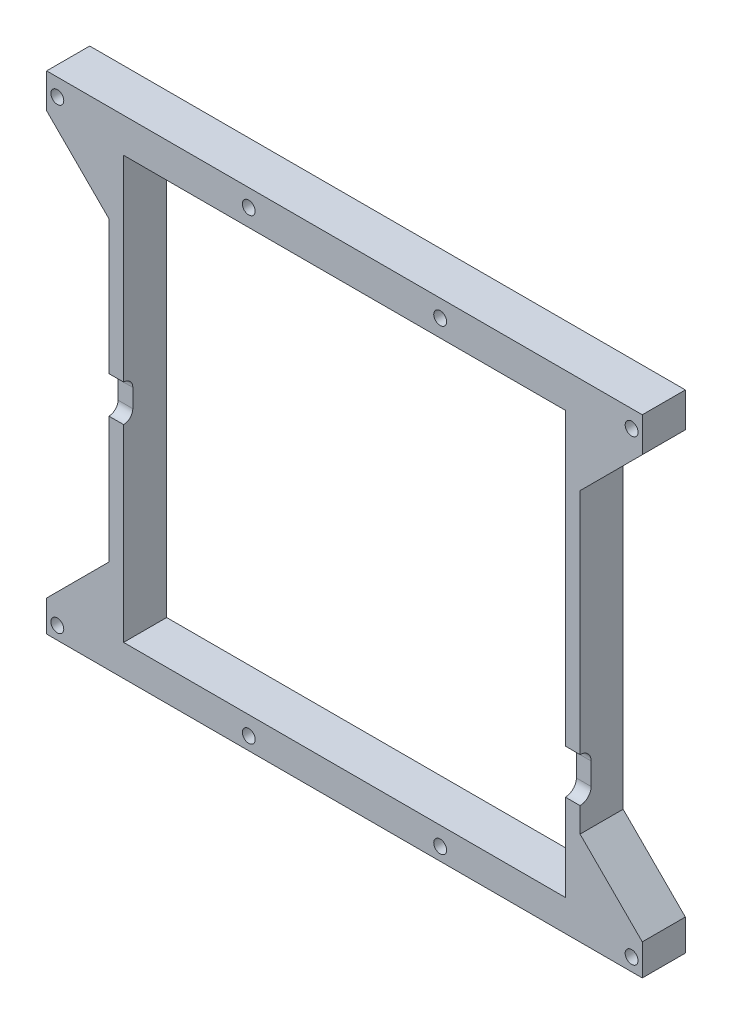
ISO-10303-21;
HEADER;
FILE_DESCRIPTION(('STEP AP214'),'2;1');
FILE_NAME('part.step','',(''),(''),'','','');
FILE_SCHEMA(('AUTOMOTIVE_DESIGN { 1 0 10303 214 1 1 1 1 }'));
ENDSEC;
DATA;
#1=APPLICATION_CONTEXT('core data for automotive mechanical design processes');
#2=APPLICATION_PROTOCOL_DEFINITION('international standard','automotive_design',2000,#1);
#3=PRODUCT_CONTEXT('',#1,'mechanical');
#4=PRODUCT('Part','Part','',(#3));
#5=PRODUCT_RELATED_PRODUCT_CATEGORY('part','',(#4));
#6=PRODUCT_DEFINITION_FORMATION('','',#4);
#7=PRODUCT_DEFINITION_CONTEXT('part definition',#1,'design');
#8=PRODUCT_DEFINITION('design','',#6,#7);
#9=PRODUCT_DEFINITION_SHAPE('','',#8);
#10=(LENGTH_UNIT() NAMED_UNIT(*) SI_UNIT(.MILLI.,.METRE.));
#11=(NAMED_UNIT(*) PLANE_ANGLE_UNIT() SI_UNIT($,.RADIAN.));
#12=(NAMED_UNIT(*) SI_UNIT($,.STERADIAN.) SOLID_ANGLE_UNIT());
#13=UNCERTAINTY_MEASURE_WITH_UNIT(LENGTH_MEASURE(1.E-05),#10,'distance_accuracy_value','');
#14=(GEOMETRIC_REPRESENTATION_CONTEXT(3) GLOBAL_UNCERTAINTY_ASSIGNED_CONTEXT((#13)) GLOBAL_UNIT_ASSIGNED_CONTEXT((#10,
#11,#12)) REPRESENTATION_CONTEXT('',''));
#15=CARTESIAN_POINT('',(0.,0.,0.));
#16=DIRECTION('',(0.,0.,1.));
#17=DIRECTION('',(1.,0.,0.));
#18=AXIS2_PLACEMENT_3D('',#15,#16,#17);
#19=CARTESIAN_POINT('',(0.,0.,5.3));
#20=DIRECTION('',(0.,0.,1.));
#21=DIRECTION('',(1.,0.,0.));
#22=AXIS2_PLACEMENT_3D('',#19,#20,#21);
#23=PLANE('',#22);
#24=CARTESIAN_POINT('',(-78.,63.0634008211343,5.3));
#25=DIRECTION('',(0.,0.,1.));
#26=DIRECTION('',(1.,0.,0.));
#27=AXIS2_PLACEMENT_3D('',#24,#25,#26);
#28=CIRCLE('',#27,1.75);
#29=CARTESIAN_POINT('',(-76.25,63.0634008211343,5.3));
#30=VERTEX_POINT('',#29);
#31=EDGE_CURVE('E402',#30,#30,#28,.F.);
#32=ORIENTED_EDGE('',*,*,#31,.F.);
#33=EDGE_LOOP('',(#32));
#34=FACE_BOUND('',#33,.T.);
#35=CARTESIAN_POINT('',(26.,-61.2365991788657,5.3));
#36=DIRECTION('',(0.,0.,1.));
#37=DIRECTION('',(1.,0.,0.));
#38=AXIS2_PLACEMENT_3D('',#35,#36,#37);
#39=CIRCLE('',#38,1.75000000000001);
#40=CARTESIAN_POINT('',(27.75,-61.2365991788657,5.3));
#41=VERTEX_POINT('',#40);
#42=EDGE_CURVE('E396',#41,#41,#39,.F.);
#43=ORIENTED_EDGE('',*,*,#42,.F.);
#44=EDGE_LOOP('',(#43));
#45=FACE_BOUND('',#44,.T.);
#46=CARTESIAN_POINT('',(-26.,63.0634008211343,5.3));
#47=DIRECTION('',(0.,0.,1.));
#48=DIRECTION('',(1.,0.,0.));
#49=AXIS2_PLACEMENT_3D('',#46,#47,#48);
#50=CIRCLE('',#49,1.75000000000001);
#51=CARTESIAN_POINT('',(-24.25,63.0634008211343,5.3));
#52=VERTEX_POINT('',#51);
#53=EDGE_CURVE('E390',#52,#52,#50,.F.);
#54=ORIENTED_EDGE('',*,*,#53,.F.);
#55=EDGE_LOOP('',(#54));
#56=FACE_BOUND('',#55,.T.);
#57=CARTESIAN_POINT('',(78.,63.0634008211343,5.3));
#58=DIRECTION('',(0.,0.,1.));
#59=DIRECTION('',(1.,0.,0.));
#60=AXIS2_PLACEMENT_3D('',#57,#58,#59);
#61=CIRCLE('',#60,1.75000000000001);
#62=CARTESIAN_POINT('',(79.75,63.0634008211343,5.3));
#63=VERTEX_POINT('',#62);
#64=EDGE_CURVE('E384',#63,#63,#61,.F.);
#65=ORIENTED_EDGE('',*,*,#64,.F.);
#66=EDGE_LOOP('',(#65));
#67=FACE_BOUND('',#66,.T.);
#68=DIRECTION('',(1.,0.,0.));
#69=VECTOR('',#68,1.);
#70=CARTESIAN_POINT('',(0.,-56.2365991788657,5.3));
#71=LINE('',#70,#69);
#72=CARTESIAN_POINT('',(-60.,-56.2365991788657,5.3));
#73=VERTEX_POINT('',#72);
#74=CARTESIAN_POINT('',(60.,-56.2365991788657,5.3));
#75=VERTEX_POINT('',#74);
#76=EDGE_CURVE('E43',#73,#75,#71,.T.);
#77=ORIENTED_EDGE('',*,*,#76,.T.);
#78=DIRECTION('',(0.,1.,0.));
#79=VECTOR('',#78,1.);
#80=CARTESIAN_POINT('',(60.,0.,5.3));
#81=LINE('',#80,#79);
#82=CARTESIAN_POINT('',(60.,58.3634008211343,5.3));
#83=VERTEX_POINT('',#82);
#84=EDGE_CURVE('E11',#75,#83,#81,.T.);
#85=ORIENTED_EDGE('',*,*,#84,.T.);
#86=DIRECTION('',(1.,0.,0.));
#87=VECTOR('',#86,1.);
#88=CARTESIAN_POINT('',(0.,58.3634008211343,5.3));
#89=LINE('',#88,#87);
#90=CARTESIAN_POINT('',(-60.,58.3634008211343,5.3));
#91=VERTEX_POINT('',#90);
#92=EDGE_CURVE('E51',#91,#83,#89,.T.);
#93=ORIENTED_EDGE('',*,*,#92,.F.);
#94=DIRECTION('',(0.,1.,0.));
#95=VECTOR('',#94,1.);
#96=CARTESIAN_POINT('',(-60.,0.,5.3));
#97=LINE('',#96,#95);
#98=EDGE_CURVE('E379',#73,#91,#97,.T.);
#99=ORIENTED_EDGE('',*,*,#98,.F.);
#100=EDGE_LOOP('',(#77,#85,#93,#99));
#101=FACE_BOUND('',#100,.T.);
#102=CARTESIAN_POINT('',(-78.,-61.2365991788657,5.3));
#103=DIRECTION('',(0.,0.,1.));
#104=DIRECTION('',(1.,0.,0.));
#105=AXIS2_PLACEMENT_3D('',#102,#103,#104);
#106=CIRCLE('',#105,1.75);
#107=CARTESIAN_POINT('',(-76.25,-61.2365991788657,5.3));
#108=VERTEX_POINT('',#107);
#109=EDGE_CURVE('E378',#108,#108,#106,.F.);
#110=ORIENTED_EDGE('',*,*,#109,.F.);
#111=EDGE_LOOP('',(#110));
#112=FACE_BOUND('',#111,.T.);
#113=CARTESIAN_POINT('',(26.,63.0634008211343,5.3));
#114=DIRECTION('',(0.,0.,1.));
#115=DIRECTION('',(1.,0.,0.));
#116=AXIS2_PLACEMENT_3D('',#113,#114,#115);
#117=CIRCLE('',#116,1.75000000000001);
#118=CARTESIAN_POINT('',(27.75,63.0634008211343,5.3));
#119=VERTEX_POINT('',#118);
#120=EDGE_CURVE('E387',#119,#119,#117,.F.);
#121=ORIENTED_EDGE('',*,*,#120,.F.);
#122=EDGE_LOOP('',(#121));
#123=FACE_BOUND('',#122,.T.);
#124=CARTESIAN_POINT('',(-26.,-61.2365991788657,5.3));
#125=DIRECTION('',(0.,0.,1.));
#126=DIRECTION('',(1.,0.,0.));
#127=AXIS2_PLACEMENT_3D('',#124,#125,#126);
#128=CIRCLE('',#127,1.75000000000001);
#129=CARTESIAN_POINT('',(-24.25,-61.2365991788657,5.3));
#130=VERTEX_POINT('',#129);
#131=EDGE_CURVE('E393',#130,#130,#128,.F.);
#132=ORIENTED_EDGE('',*,*,#131,.F.);
#133=EDGE_LOOP('',(#132));
#134=FACE_BOUND('',#133,.T.);
#135=CARTESIAN_POINT('',(78.,-61.2365991788657,5.3));
#136=DIRECTION('',(0.,0.,1.));
#137=DIRECTION('',(1.,0.,0.));
#138=AXIS2_PLACEMENT_3D('',#135,#136,#137);
#139=CIRCLE('',#138,1.75000000000001);
#140=CARTESIAN_POINT('',(79.75,-61.2365991788657,5.3));
#141=VERTEX_POINT('',#140);
#142=EDGE_CURVE('E399',#141,#141,#139,.F.);
#143=ORIENTED_EDGE('',*,*,#142,.F.);
#144=EDGE_LOOP('',(#143));
#145=FACE_BOUND('',#144,.T.);
#146=DIRECTION('',(-0.707106781186546,-0.707106781186549,0.));
#147=VECTOR('',#146,1.);
#148=CARTESIAN_POINT('',(11.268299589433,-11.2682995894329,5.3));
#149=LINE('',#148,#147);
#150=CARTESIAN_POINT('',(80.9,58.3634008211343,5.3));
#151=VERTEX_POINT('',#150);
#152=CARTESIAN_POINT('',(64.,41.4634008211343,5.3));
#153=VERTEX_POINT('',#152);
#154=EDGE_CURVE('E408',#151,#153,#149,.T.);
#155=ORIENTED_EDGE('',*,*,#154,.T.);
#156=DIRECTION('',(0.,-1.,0.));
#157=VECTOR('',#156,1.);
#158=CARTESIAN_POINT('',(64.,0.,5.3));
#159=LINE('',#158,#157);
#160=CARTESIAN_POINT('',(64.,-39.3365991788659,5.3));
#161=VERTEX_POINT('',#160);
#162=EDGE_CURVE('E376',#153,#161,#159,.T.);
#163=ORIENTED_EDGE('',*,*,#162,.T.);
#164=DIRECTION('',(0.707106781186552,-0.707106781186544,0.));
#165=VECTOR('',#164,1.);
#166=CARTESIAN_POINT('',(12.3317004105667,12.3317004105669,5.3));
#167=LINE('',#166,#165);
#168=CARTESIAN_POINT('',(80.9,-56.2365991788657,5.3));
#169=VERTEX_POINT('',#168);
#170=EDGE_CURVE('E411',#161,#169,#167,.T.);
#171=ORIENTED_EDGE('',*,*,#170,.T.);
#172=DIRECTION('',(0.,1.,0.));
#173=VECTOR('',#172,1.);
#174=CARTESIAN_POINT('',(80.9,0.,5.3));
#175=LINE('',#174,#173);
#176=CARTESIAN_POINT('',(80.9,-64.7365991788657,5.3));
#177=VERTEX_POINT('',#176);
#178=EDGE_CURVE('E405',#177,#169,#175,.T.);
#179=ORIENTED_EDGE('',*,*,#178,.F.);
#180=DIRECTION('',(1.,0.,0.));
#181=VECTOR('',#180,1.);
#182=CARTESIAN_POINT('',(0.,-64.7365991788657,5.3));
#183=LINE('',#182,#181);
#184=CARTESIAN_POINT('',(-80.9,-64.7365991788657,5.3));
#185=VERTEX_POINT('',#184);
#186=EDGE_CURVE('E416',#185,#177,#183,.T.);
#187=ORIENTED_EDGE('',*,*,#186,.F.);
#188=DIRECTION('',(0.,1.,0.));
#189=VECTOR('',#188,1.);
#190=CARTESIAN_POINT('',(-80.9,0.,5.3));
#191=LINE('',#190,#189);
#192=CARTESIAN_POINT('',(-80.9,-56.2365991788657,5.3));
#193=VERTEX_POINT('',#192);
#194=EDGE_CURVE('E414',#185,#193,#191,.T.);
#195=ORIENTED_EDGE('',*,*,#194,.T.);
#196=DIRECTION('',(-0.707106781186551,-0.707106781186544,0.));
#197=VECTOR('',#196,1.);
#198=CARTESIAN_POINT('',(-12.3317004105667,12.3317004105669,5.3));
#199=LINE('',#198,#197);
#200=CARTESIAN_POINT('',(-64.,-39.3365991788658,5.3));
#201=VERTEX_POINT('',#200);
#202=EDGE_CURVE('E418',#201,#193,#199,.T.);
#203=ORIENTED_EDGE('',*,*,#202,.F.);
#204=DIRECTION('',(0.,-1.,0.));
#205=VECTOR('',#204,1.);
#206=CARTESIAN_POINT('',(-64.,0.,5.3));
#207=LINE('',#206,#205);
#208=CARTESIAN_POINT('',(-64.,41.4634008211343,5.3));
#209=VERTEX_POINT('',#208);
#210=EDGE_CURVE('E423',#209,#201,#207,.T.);
#211=ORIENTED_EDGE('',*,*,#210,.F.);
#212=DIRECTION('',(0.707106781186546,-0.707106781186549,0.));
#213=VECTOR('',#212,1.);
#214=CARTESIAN_POINT('',(-11.268299589433,-11.2682995894329,5.3));
#215=LINE('',#214,#213);
#216=CARTESIAN_POINT('',(-80.9,58.3634008211343,5.3));
#217=VERTEX_POINT('',#216);
#218=EDGE_CURVE('E425',#217,#209,#215,.T.);
#219=ORIENTED_EDGE('',*,*,#218,.F.);
#220=DIRECTION('',(0.,1.,0.));
#221=VECTOR('',#220,1.);
#222=CARTESIAN_POINT('',(-80.9,0.,5.3));
#223=LINE('',#222,#221);
#224=CARTESIAN_POINT('',(-80.9,67.7634008211344,5.3));
#225=VERTEX_POINT('',#224);
#226=EDGE_CURVE('E421',#217,#225,#223,.T.);
#227=ORIENTED_EDGE('',*,*,#226,.T.);
#228=DIRECTION('',(1.,0.,0.));
#229=VECTOR('',#228,1.);
#230=CARTESIAN_POINT('',(0.,67.7634008211343,5.3));
#231=LINE('',#230,#229);
#232=CARTESIAN_POINT('',(80.9,67.7634008211343,5.3));
#233=VERTEX_POINT('',#232);
#234=EDGE_CURVE('E381',#225,#233,#231,.T.);
#235=ORIENTED_EDGE('',*,*,#234,.T.);
#236=DIRECTION('',(0.,1.,0.));
#237=VECTOR('',#236,1.);
#238=CARTESIAN_POINT('',(80.9,0.,5.3));
#239=LINE('',#238,#237);
#240=EDGE_CURVE('E38',#151,#233,#239,.T.);
#241=ORIENTED_EDGE('',*,*,#240,.F.);
#242=EDGE_LOOP('',(#155,#163,#171,#179,#187,#195,#203,#211,#219,#227,#235,#241));
#243=FACE_BOUND('',#242,.T.);
#244=ADVANCED_FACE('F35',(#34,#45,#56,#67,#101,#112,#123,#134,#145,#243),#23,.F.);
#245=CARTESIAN_POINT('',(0.,67.7634008211343,0.8));
#246=DIRECTION('',(0.,1.,0.));
#247=DIRECTION('',(-1.,0.,0.));
#248=AXIS2_PLACEMENT_3D('',#245,#246,#247);
#249=PLANE('',#248);
#250=ORIENTED_EDGE('',*,*,#234,.F.);
#251=DIRECTION('',(0.,0.,-1.));
#252=VECTOR('',#251,1.);
#253=CARTESIAN_POINT('',(-80.9,67.7634008211344,0.8));
#254=LINE('',#253,#252);
#255=CARTESIAN_POINT('',(-80.9,67.7634008211344,17.));
#256=VERTEX_POINT('',#255);
#257=EDGE_CURVE('E330',#256,#225,#254,.T.);
#258=ORIENTED_EDGE('',*,*,#257,.F.);
#259=DIRECTION('',(1.,0.,0.));
#260=VECTOR('',#259,1.);
#261=CARTESIAN_POINT('',(0.,67.7634008211343,17.));
#262=LINE('',#261,#260);
#263=CARTESIAN_POINT('',(80.9,67.7634008211343,17.));
#264=VERTEX_POINT('',#263);
#265=EDGE_CURVE('E259',#256,#264,#262,.T.);
#266=ORIENTED_EDGE('',*,*,#265,.T.);
#267=DIRECTION('',(0.,0.,-1.));
#268=VECTOR('',#267,1.);
#269=CARTESIAN_POINT('',(80.9,67.7634008211343,0.8));
#270=LINE('',#269,#268);
#271=EDGE_CURVE('E327',#264,#233,#270,.T.);
#272=ORIENTED_EDGE('',*,*,#271,.T.);
#273=EDGE_LOOP('',(#250,#258,#266,#272));
#274=FACE_BOUND('',#273,.T.);
#275=ADVANCED_FACE('F435',(#274),#249,.T.);
#276=CARTESIAN_POINT('',(-80.9,0.,0.8));
#277=DIRECTION('',(-1.,0.,0.));
#278=DIRECTION('',(0.,0.,1.));
#279=AXIS2_PLACEMENT_3D('',#276,#277,#278);
#280=PLANE('',#279);
#281=ORIENTED_EDGE('',*,*,#226,.F.);
#282=DIRECTION('',(0.,0.,-1.));
#283=VECTOR('',#282,1.);
#284=CARTESIAN_POINT('',(-80.9,58.3634008211343,0.8));
#285=LINE('',#284,#283);
#286=CARTESIAN_POINT('',(-80.9,58.3634008211343,17.));
#287=VERTEX_POINT('',#286);
#288=EDGE_CURVE('E333',#287,#217,#285,.T.);
#289=ORIENTED_EDGE('',*,*,#288,.F.);
#290=DIRECTION('',(0.,1.,0.));
#291=VECTOR('',#290,1.);
#292=CARTESIAN_POINT('',(-80.9,0.,17.));
#293=LINE('',#292,#291);
#294=EDGE_CURVE('E257',#287,#256,#293,.T.);
#295=ORIENTED_EDGE('',*,*,#294,.T.);
#296=ORIENTED_EDGE('',*,*,#257,.T.);
#297=EDGE_LOOP('',(#281,#289,#295,#296));
#298=FACE_BOUND('',#297,.T.);
#299=ADVANCED_FACE('F504',(#298),#280,.T.);
#300=CARTESIAN_POINT('',(-48.8196601125011,2.5,17.));
#301=DIRECTION('',(-1.,0.,0.));
#302=DIRECTION('',(0.,-1.,0.));
#303=AXIS2_PLACEMENT_3D('',#300,#301,#302);
#304=CYLINDRICAL_SURFACE('',#303,2.49999999999998);
#305=DIRECTION('',(-1.,0.,0.));
#306=VECTOR('',#305,1.);
#307=CARTESIAN_POINT('',(-48.8196601125011,4.99999999999998,17.));
#308=LINE('',#307,#306);
#309=CARTESIAN_POINT('',(-64.,4.99999999999998,17.));
#310=VERTEX_POINT('',#309);
#311=CARTESIAN_POINT('',(-60.,4.99999999999998,17.));
#312=VERTEX_POINT('',#311);
#313=EDGE_CURVE('E277',#310,#312,#308,.F.);
#314=ORIENTED_EDGE('',*,*,#313,.F.);
#315=CARTESIAN_POINT('',(-64.,2.5,17.));
#316=DIRECTION('',(1.,0.,0.));
#317=DIRECTION('',(0.,1.,0.));
#318=AXIS2_PLACEMENT_3D('',#315,#316,#317);
#319=CIRCLE('',#318,2.49999999999998);
#320=CARTESIAN_POINT('',(-64.,2.5,14.5));
#321=VERTEX_POINT('',#320);
#322=EDGE_CURVE('E236',#321,#310,#319,.T.);
#323=ORIENTED_EDGE('',*,*,#322,.F.);
#324=DIRECTION('',(-1.,0.,0.));
#325=VECTOR('',#324,1.);
#326=CARTESIAN_POINT('',(-48.8196601125011,2.49999999999999,14.5));
#327=LINE('',#326,#325);
#328=CARTESIAN_POINT('',(-60.,2.5,14.5));
#329=VERTEX_POINT('',#328);
#330=EDGE_CURVE('E241',#329,#321,#327,.T.);
#331=ORIENTED_EDGE('',*,*,#330,.F.);
#332=CARTESIAN_POINT('',(-60.,2.5,17.));
#333=DIRECTION('',(-1.,0.,0.));
#334=DIRECTION('',(0.,-1.,0.));
#335=AXIS2_PLACEMENT_3D('',#332,#333,#334);
#336=CIRCLE('',#335,2.49999999999998);
#337=EDGE_CURVE('E244',#329,#312,#336,.F.);
#338=ORIENTED_EDGE('',*,*,#337,.T.);
#339=EDGE_LOOP('',(#314,#323,#331,#338));
#340=FACE_BOUND('',#339,.T.);
#341=ADVANCED_FACE('F493',(#340),#304,.F.);
#342=CARTESIAN_POINT('',(-48.8196601125011,0.,14.5));
#343=DIRECTION('',(0.,0.,-1.));
#344=DIRECTION('',(-1.,0.,0.));
#345=AXIS2_PLACEMENT_3D('',#342,#343,#344);
#346=PLANE('',#345);
#347=DIRECTION('',(-1.,0.,0.));
#348=VECTOR('',#347,1.);
#349=CARTESIAN_POINT('',(-48.8196601125011,-2.5,14.5));
#350=LINE('',#349,#348);
#351=CARTESIAN_POINT('',(-60.,-2.5,14.5));
#352=VERTEX_POINT('',#351);
#353=CARTESIAN_POINT('',(-64.,-2.5,14.5));
#354=VERTEX_POINT('',#353);
#355=EDGE_CURVE('E238',#352,#354,#350,.T.);
#356=ORIENTED_EDGE('',*,*,#355,.F.);
#357=DIRECTION('',(0.,1.,0.));
#358=VECTOR('',#357,1.);
#359=CARTESIAN_POINT('',(-60.,0.,14.5));
#360=LINE('',#359,#358);
#361=EDGE_CURVE('E245',#352,#329,#360,.T.);
#362=ORIENTED_EDGE('',*,*,#361,.T.);
#363=ORIENTED_EDGE('',*,*,#330,.T.);
#364=DIRECTION('',(0.,1.,0.));
#365=VECTOR('',#364,1.);
#366=CARTESIAN_POINT('',(-64.,0.,14.5));
#367=LINE('',#366,#365);
#368=EDGE_CURVE('E233',#354,#321,#367,.T.);
#369=ORIENTED_EDGE('',*,*,#368,.F.);
#370=EDGE_LOOP('',(#356,#362,#363,#369));
#371=FACE_BOUND('',#370,.T.);
#372=ADVANCED_FACE('F488',(#371),#346,.F.);
#373=CARTESIAN_POINT('',(-48.8196601125011,-2.5,17.));
#374=DIRECTION('',(-1.,0.,0.));
#375=DIRECTION('',(0.,-1.,0.));
#376=AXIS2_PLACEMENT_3D('',#373,#374,#375);
#377=CYLINDRICAL_SURFACE('',#376,2.49999999999998);
#378=DIRECTION('',(-1.,0.,0.));
#379=VECTOR('',#378,1.);
#380=CARTESIAN_POINT('',(-48.8196601125011,-4.99999999999999,17.));
#381=LINE('',#380,#379);
#382=CARTESIAN_POINT('',(-60.,-4.99999999999999,17.));
#383=VERTEX_POINT('',#382);
#384=CARTESIAN_POINT('',(-64.,-4.99999999999999,17.));
#385=VERTEX_POINT('',#384);
#386=EDGE_CURVE('E280',#383,#385,#381,.T.);
#387=ORIENTED_EDGE('',*,*,#386,.F.);
#388=CARTESIAN_POINT('',(-60.,-2.5,17.));
#389=DIRECTION('',(-1.,0.,0.));
#390=DIRECTION('',(0.,-1.,0.));
#391=AXIS2_PLACEMENT_3D('',#388,#389,#390);
#392=CIRCLE('',#391,2.49999999999998);
#393=EDGE_CURVE('E247',#383,#352,#392,.F.);
#394=ORIENTED_EDGE('',*,*,#393,.T.);
#395=ORIENTED_EDGE('',*,*,#355,.T.);
#396=CARTESIAN_POINT('',(-64.,-2.5,17.));
#397=DIRECTION('',(1.,0.,0.));
#398=DIRECTION('',(0.,1.,0.));
#399=AXIS2_PLACEMENT_3D('',#396,#397,#398);
#400=CIRCLE('',#399,2.49999999999998);
#401=EDGE_CURVE('E370',#385,#354,#400,.T.);
#402=ORIENTED_EDGE('',*,*,#401,.F.);
#403=EDGE_LOOP('',(#387,#394,#395,#402));
#404=FACE_BOUND('',#403,.T.);
#405=ADVANCED_FACE('F482',(#404),#377,.F.);
#406=CARTESIAN_POINT('',(-11.268299589433,-11.2682995894329,0.8));
#407=DIRECTION('',(0.707106781186549,0.707106781186546,0.));
#408=DIRECTION('',(-0.707106781186546,0.707106781186549,0.));
#409=AXIS2_PLACEMENT_3D('',#406,#407,#408);
#410=PLANE('',#409);
#411=ORIENTED_EDGE('',*,*,#288,.T.);
#412=ORIENTED_EDGE('',*,*,#218,.T.);
#413=DIRECTION('',(0.,0.,-1.));
#414=VECTOR('',#413,1.);
#415=CARTESIAN_POINT('',(-64.,41.4634008211343,0.8));
#416=LINE('',#415,#414);
#417=CARTESIAN_POINT('',(-64.,41.4634008211343,17.));
#418=VERTEX_POINT('',#417);
#419=EDGE_CURVE('E336',#418,#209,#416,.T.);
#420=ORIENTED_EDGE('',*,*,#419,.F.);
#421=DIRECTION('',(0.707106781186546,-0.707106781186549,0.));
#422=VECTOR('',#421,1.);
#423=CARTESIAN_POINT('',(-11.268299589433,-11.2682995894329,17.));
#424=LINE('',#423,#422);
#425=EDGE_CURVE('E310',#287,#418,#424,.T.);
#426=ORIENTED_EDGE('',*,*,#425,.F.);
#427=EDGE_LOOP('',(#411,#412,#420,#426));
#428=FACE_BOUND('',#427,.T.);
#429=ADVANCED_FACE('F502',(#428),#410,.F.);
#430=CARTESIAN_POINT('',(-64.,0.,0.8));
#431=DIRECTION('',(1.,0.,0.));
#432=DIRECTION('',(0.,1.,0.));
#433=AXIS2_PLACEMENT_3D('',#430,#431,#432);
#434=PLANE('',#433);
#435=ORIENTED_EDGE('',*,*,#419,.T.);
#436=ORIENTED_EDGE('',*,*,#210,.T.);
#437=DIRECTION('',(0.,0.,-1.));
#438=VECTOR('',#437,1.);
#439=CARTESIAN_POINT('',(-64.,-39.3365991788658,0.8));
#440=LINE('',#439,#438);
#441=CARTESIAN_POINT('',(-64.,-39.3365991788658,17.));
#442=VERTEX_POINT('',#441);
#443=EDGE_CURVE('E339',#442,#201,#440,.T.);
#444=ORIENTED_EDGE('',*,*,#443,.F.);
#445=DIRECTION('',(0.,-1.,0.));
#446=VECTOR('',#445,1.);
#447=CARTESIAN_POINT('',(-64.,0.,17.));
#448=LINE('',#447,#446);
#449=EDGE_CURVE('E314',#385,#442,#448,.T.);
#450=ORIENTED_EDGE('',*,*,#449,.F.);
#451=ORIENTED_EDGE('',*,*,#401,.T.);
#452=ORIENTED_EDGE('',*,*,#368,.T.);
#453=ORIENTED_EDGE('',*,*,#322,.T.);
#454=EDGE_CURVE('E313',#418,#310,#448,.T.);
#455=ORIENTED_EDGE('',*,*,#454,.F.);
#456=EDGE_LOOP('',(#435,#436,#444,#450,#451,#452,#453,#455));
#457=FACE_BOUND('',#456,.T.);
#458=ADVANCED_FACE('F477',(#457),#434,.F.);
#459=CARTESIAN_POINT('',(-12.3317004105667,12.3317004105669,0.8));
#460=DIRECTION('',(0.707106781186544,-0.707106781186551,0.));
#461=DIRECTION('',(0.707106781186551,0.707106781186544,0.));
#462=AXIS2_PLACEMENT_3D('',#459,#460,#461);
#463=PLANE('',#462);
#464=ORIENTED_EDGE('',*,*,#443,.T.);
#465=ORIENTED_EDGE('',*,*,#202,.T.);
#466=DIRECTION('',(0.,0.,-1.));
#467=VECTOR('',#466,1.);
#468=CARTESIAN_POINT('',(-80.9,-56.2365991788657,0.8));
#469=LINE('',#468,#467);
#470=CARTESIAN_POINT('',(-80.9,-56.2365991788657,17.));
#471=VERTEX_POINT('',#470);
#472=EDGE_CURVE('E342',#471,#193,#469,.T.);
#473=ORIENTED_EDGE('',*,*,#472,.F.);
#474=DIRECTION('',(-0.707106781186551,-0.707106781186544,0.));
#475=VECTOR('',#474,1.);
#476=CARTESIAN_POINT('',(-12.3317004105667,12.3317004105669,17.));
#477=LINE('',#476,#475);
#478=EDGE_CURVE('E317',#442,#471,#477,.T.);
#479=ORIENTED_EDGE('',*,*,#478,.F.);
#480=EDGE_LOOP('',(#464,#465,#473,#479));
#481=FACE_BOUND('',#480,.T.);
#482=ADVANCED_FACE('F474',(#481),#463,.F.);
#483=CARTESIAN_POINT('',(-80.9,0.,0.8));
#484=DIRECTION('',(-1.,0.,0.));
#485=DIRECTION('',(0.,0.,1.));
#486=AXIS2_PLACEMENT_3D('',#483,#484,#485);
#487=PLANE('',#486);
#488=ORIENTED_EDGE('',*,*,#194,.F.);
#489=DIRECTION('',(0.,0.,-1.));
#490=VECTOR('',#489,1.);
#491=CARTESIAN_POINT('',(-80.9,-64.7365991788657,0.8));
#492=LINE('',#491,#490);
#493=CARTESIAN_POINT('',(-80.9,-64.7365991788657,17.));
#494=VERTEX_POINT('',#493);
#495=EDGE_CURVE('E345',#494,#185,#492,.T.);
#496=ORIENTED_EDGE('',*,*,#495,.F.);
#497=DIRECTION('',(0.,1.,0.));
#498=VECTOR('',#497,1.);
#499=CARTESIAN_POINT('',(-80.9,0.,17.));
#500=LINE('',#499,#498);
#501=EDGE_CURVE('E255',#494,#471,#500,.T.);
#502=ORIENTED_EDGE('',*,*,#501,.T.);
#503=ORIENTED_EDGE('',*,*,#472,.T.);
#504=EDGE_LOOP('',(#488,#496,#502,#503));
#505=FACE_BOUND('',#504,.T.);
#506=ADVANCED_FACE('F470',(#505),#487,.T.);
#507=CARTESIAN_POINT('',(0.,-64.7365991788657,0.8));
#508=DIRECTION('',(0.,1.,0.));
#509=DIRECTION('',(-1.,0.,0.));
#510=AXIS2_PLACEMENT_3D('',#507,#508,#509);
#511=PLANE('',#510);
#512=ORIENTED_EDGE('',*,*,#495,.T.);
#513=ORIENTED_EDGE('',*,*,#186,.T.);
#514=DIRECTION('',(0.,0.,-1.));
#515=VECTOR('',#514,1.);
#516=CARTESIAN_POINT('',(80.9,-64.7365991788657,0.8));
#517=LINE('',#516,#515);
#518=CARTESIAN_POINT('',(80.9,-64.7365991788657,17.));
#519=VERTEX_POINT('',#518);
#520=EDGE_CURVE('E348',#519,#177,#517,.T.);
#521=ORIENTED_EDGE('',*,*,#520,.F.);
#522=DIRECTION('',(1.,0.,0.));
#523=VECTOR('',#522,1.);
#524=CARTESIAN_POINT('',(0.,-64.7365991788657,17.));
#525=LINE('',#524,#523);
#526=EDGE_CURVE('E320',#494,#519,#525,.T.);
#527=ORIENTED_EDGE('',*,*,#526,.F.);
#528=EDGE_LOOP('',(#512,#513,#521,#527));
#529=FACE_BOUND('',#528,.T.);
#530=ADVANCED_FACE('F461',(#529),#511,.F.);
#531=CARTESIAN_POINT('',(80.9,0.,0.8));
#532=DIRECTION('',(-1.,0.,0.));
#533=DIRECTION('',(0.,0.,1.));
#534=AXIS2_PLACEMENT_3D('',#531,#532,#533);
#535=PLANE('',#534);
#536=ORIENTED_EDGE('',*,*,#520,.T.);
#537=ORIENTED_EDGE('',*,*,#178,.T.);
#538=DIRECTION('',(0.,0.,-1.));
#539=VECTOR('',#538,1.);
#540=CARTESIAN_POINT('',(80.9,-56.2365991788657,0.8));
#541=LINE('',#540,#539);
#542=CARTESIAN_POINT('',(80.9,-56.2365991788657,17.));
#543=VERTEX_POINT('',#542);
#544=EDGE_CURVE('E351',#543,#169,#541,.T.);
#545=ORIENTED_EDGE('',*,*,#544,.F.);
#546=DIRECTION('',(0.,1.,0.));
#547=VECTOR('',#546,1.);
#548=CARTESIAN_POINT('',(80.9,0.,17.));
#549=LINE('',#548,#547);
#550=EDGE_CURVE('E232',#519,#543,#549,.T.);
#551=ORIENTED_EDGE('',*,*,#550,.F.);
#552=EDGE_LOOP('',(#536,#537,#545,#551));
#553=FACE_BOUND('',#552,.T.);
#554=ADVANCED_FACE('F458',(#553),#535,.F.);
#555=CARTESIAN_POINT('',(80.9,0.,0.8));
#556=DIRECTION('',(-1.,0.,0.));
#557=DIRECTION('',(0.,0.,1.));
#558=AXIS2_PLACEMENT_3D('',#555,#556,#557);
#559=PLANE('',#558);
#560=DIRECTION('',(0.,0.,-1.));
#561=VECTOR('',#560,1.);
#562=CARTESIAN_POINT('',(80.9,58.3634008211343,0.8));
#563=LINE('',#562,#561);
#564=CARTESIAN_POINT('',(80.9,58.3634008211343,17.));
#565=VERTEX_POINT('',#564);
#566=EDGE_CURVE('E251',#565,#151,#563,.T.);
#567=ORIENTED_EDGE('',*,*,#566,.T.);
#568=ORIENTED_EDGE('',*,*,#240,.T.);
#569=ORIENTED_EDGE('',*,*,#271,.F.);
#570=DIRECTION('',(0.,1.,0.));
#571=VECTOR('',#570,1.);
#572=CARTESIAN_POINT('',(80.9,0.,17.));
#573=LINE('',#572,#571);
#574=EDGE_CURVE('E307',#565,#264,#573,.T.);
#575=ORIENTED_EDGE('',*,*,#574,.F.);
#576=EDGE_LOOP('',(#567,#568,#569,#575));
#577=FACE_BOUND('',#576,.T.);
#578=ADVANCED_FACE('F439',(#577),#559,.F.);
#579=CARTESIAN_POINT('',(12.3317004105667,12.3317004105669,0.8));
#580=DIRECTION('',(0.707106781186543,0.707106781186551,0.));
#581=DIRECTION('',(-0.707106781186552,0.707106781186544,0.));
#582=AXIS2_PLACEMENT_3D('',#579,#580,#581);
#583=PLANE('',#582);
#584=ORIENTED_EDGE('',*,*,#170,.F.);
#585=DIRECTION('',(0.,0.,-1.));
#586=VECTOR('',#585,1.);
#587=CARTESIAN_POINT('',(64.,-39.3365991788659,0.8));
#588=LINE('',#587,#586);
#589=CARTESIAN_POINT('',(64.,-39.3365991788659,17.));
#590=VERTEX_POINT('',#589);
#591=EDGE_CURVE('E354',#590,#161,#588,.T.);
#592=ORIENTED_EDGE('',*,*,#591,.F.);
#593=DIRECTION('',(0.707106781186552,-0.707106781186544,0.));
#594=VECTOR('',#593,1.);
#595=CARTESIAN_POINT('',(12.3317004105667,12.3317004105669,17.));
#596=LINE('',#595,#594);
#597=EDGE_CURVE('E253',#590,#543,#596,.T.);
#598=ORIENTED_EDGE('',*,*,#597,.T.);
#599=ORIENTED_EDGE('',*,*,#544,.T.);
#600=EDGE_LOOP('',(#584,#592,#598,#599));
#601=FACE_BOUND('',#600,.T.);
#602=ADVANCED_FACE('F454',(#601),#583,.T.);
#603=CARTESIAN_POINT('',(-60.,0.,27.));
#604=DIRECTION('',(-1.,0.,0.));
#605=DIRECTION('',(0.,-1.,0.));
#606=AXIS2_PLACEMENT_3D('',#603,#604,#605);
#607=PLANE('',#606);
#608=DIRECTION('',(0.,0.,-1.));
#609=VECTOR('',#608,1.);
#610=CARTESIAN_POINT('',(-60.,-56.2365991788657,27.));
#611=LINE('',#610,#609);
#612=CARTESIAN_POINT('',(-60.,-56.2365991788657,17.));
#613=VERTEX_POINT('',#612);
#614=EDGE_CURVE('E363',#613,#73,#611,.T.);
#615=ORIENTED_EDGE('',*,*,#614,.T.);
#616=ORIENTED_EDGE('',*,*,#98,.T.);
#617=DIRECTION('',(0.,0.,-1.));
#618=VECTOR('',#617,1.);
#619=CARTESIAN_POINT('',(-60.,58.3634008211343,27.));
#620=LINE('',#619,#618);
#621=CARTESIAN_POINT('',(-60.,58.3634008211343,17.));
#622=VERTEX_POINT('',#621);
#623=EDGE_CURVE('E366',#622,#91,#620,.T.);
#624=ORIENTED_EDGE('',*,*,#623,.F.);
#625=DIRECTION('',(0.,1.,0.));
#626=VECTOR('',#625,1.);
#627=CARTESIAN_POINT('',(-60.,0.,17.));
#628=LINE('',#627,#626);
#629=EDGE_CURVE('E274',#312,#622,#628,.T.);
#630=ORIENTED_EDGE('',*,*,#629,.F.);
#631=ORIENTED_EDGE('',*,*,#337,.F.);
#632=ORIENTED_EDGE('',*,*,#361,.F.);
#633=ORIENTED_EDGE('',*,*,#393,.F.);
#634=EDGE_CURVE('E273',#613,#383,#628,.T.);
#635=ORIENTED_EDGE('',*,*,#634,.F.);
#636=EDGE_LOOP('',(#615,#616,#624,#630,#631,#632,#633,#635));
#637=FACE_BOUND('',#636,.T.);
#638=ADVANCED_FACE('F496',(#637),#607,.F.);
#639=CARTESIAN_POINT('',(0.,58.3634008211343,27.));
#640=DIRECTION('',(0.,1.,0.));
#641=DIRECTION('',(0.,0.,1.));
#642=AXIS2_PLACEMENT_3D('',#639,#640,#641);
#643=PLANE('',#642);
#644=ORIENTED_EDGE('',*,*,#623,.T.);
#645=ORIENTED_EDGE('',*,*,#92,.T.);
#646=DIRECTION('',(0.,0.,-1.));
#647=VECTOR('',#646,1.);
#648=CARTESIAN_POINT('',(60.,58.3634008211343,27.));
#649=LINE('',#648,#647);
#650=CARTESIAN_POINT('',(60.,58.3634008211343,17.));
#651=VERTEX_POINT('',#650);
#652=EDGE_CURVE('E237',#651,#83,#649,.T.);
#653=ORIENTED_EDGE('',*,*,#652,.F.);
#654=DIRECTION('',(1.,0.,0.));
#655=VECTOR('',#654,1.);
#656=CARTESIAN_POINT('',(0.,58.3634008211343,17.));
#657=LINE('',#656,#655);
#658=EDGE_CURVE('E270',#622,#651,#657,.T.);
#659=ORIENTED_EDGE('',*,*,#658,.F.);
#660=EDGE_LOOP('',(#644,#645,#653,#659));
#661=FACE_BOUND('',#660,.T.);
#662=ADVANCED_FACE('F595',(#661),#643,.F.);
#663=CARTESIAN_POINT('',(0.,0.,17.));
#664=DIRECTION('',(0.,0.,1.));
#665=DIRECTION('',(1.,0.,0.));
#666=AXIS2_PLACEMENT_3D('',#663,#664,#665);
#667=PLANE('',#666);
#668=DIRECTION('',(1.,0.,0.));
#669=VECTOR('',#668,1.);
#670=CARTESIAN_POINT('',(46.5835921350012,-20.6365991788657,17.));
#671=LINE('',#670,#669);
#672=CARTESIAN_POINT('',(64.,-20.6365991788657,17.));
#673=VERTEX_POINT('',#672);
#674=CARTESIAN_POINT('',(60.,-20.6365991788657,17.));
#675=VERTEX_POINT('',#674);
#676=EDGE_CURVE('E203',#673,#675,#671,.F.);
#677=ORIENTED_EDGE('',*,*,#676,.F.);
#678=DIRECTION('',(0.,-1.,0.));
#679=VECTOR('',#678,1.);
#680=CARTESIAN_POINT('',(64.,0.,17.));
#681=LINE('',#680,#679);
#682=CARTESIAN_POINT('',(64.,41.4634008211343,17.));
#683=VERTEX_POINT('',#682);
#684=EDGE_CURVE('E248',#683,#673,#681,.T.);
#685=ORIENTED_EDGE('',*,*,#684,.F.);
#686=DIRECTION('',(-0.707106781186546,-0.707106781186549,0.));
#687=VECTOR('',#686,1.);
#688=CARTESIAN_POINT('',(11.268299589433,-11.2682995894329,17.));
#689=LINE('',#688,#687);
#690=EDGE_CURVE('E261',#565,#683,#689,.T.);
#691=ORIENTED_EDGE('',*,*,#690,.F.);
#692=ORIENTED_EDGE('',*,*,#574,.T.);
#693=ORIENTED_EDGE('',*,*,#265,.F.);
#694=ORIENTED_EDGE('',*,*,#294,.F.);
#695=ORIENTED_EDGE('',*,*,#425,.T.);
#696=ORIENTED_EDGE('',*,*,#454,.T.);
#697=ORIENTED_EDGE('',*,*,#313,.T.);
#698=ORIENTED_EDGE('',*,*,#629,.T.);
#699=ORIENTED_EDGE('',*,*,#658,.T.);
#700=DIRECTION('',(0.,1.,0.));
#701=VECTOR('',#700,1.);
#702=CARTESIAN_POINT('',(60.,0.,17.));
#703=LINE('',#702,#701);
#704=EDGE_CURVE('E266',#675,#651,#703,.T.);
#705=ORIENTED_EDGE('',*,*,#704,.F.);
#706=EDGE_LOOP('',(#677,#685,#691,#692,#693,#694,#695,#696,#697,#698,#699,#705));
#707=FACE_BOUND('',#706,.T.);
#708=CARTESIAN_POINT('',(78.,63.0634008211343,17.));
#709=DIRECTION('',(0.,0.,1.));
#710=DIRECTION('',(1.,0.,0.));
#711=AXIS2_PLACEMENT_3D('',#708,#709,#710);
#712=CIRCLE('',#711,1.75000000000001);
#713=CARTESIAN_POINT('',(79.75,63.0634008211343,17.));
#714=VERTEX_POINT('',#713);
#715=EDGE_CURVE('E286',#714,#714,#712,.F.);
#716=ORIENTED_EDGE('',*,*,#715,.T.);
#717=EDGE_LOOP('',(#716));
#718=FACE_BOUND('',#717,.T.);
#719=CARTESIAN_POINT('',(-26.,63.0634008211343,17.));
#720=DIRECTION('',(0.,0.,1.));
#721=DIRECTION('',(1.,0.,0.));
#722=AXIS2_PLACEMENT_3D('',#719,#720,#721);
#723=CIRCLE('',#722,1.75000000000001);
#724=CARTESIAN_POINT('',(-24.25,63.0634008211343,17.));
#725=VERTEX_POINT('',#724);
#726=EDGE_CURVE('E292',#725,#725,#723,.F.);
#727=ORIENTED_EDGE('',*,*,#726,.T.);
#728=EDGE_LOOP('',(#727));
#729=FACE_BOUND('',#728,.T.);
#730=CARTESIAN_POINT('',(-78.,63.0634008211343,17.));
#731=DIRECTION('',(0.,0.,1.));
#732=DIRECTION('',(1.,0.,0.));
#733=AXIS2_PLACEMENT_3D('',#730,#731,#732);
#734=CIRCLE('',#733,1.75);
#735=CARTESIAN_POINT('',(-76.25,63.0634008211343,17.));
#736=VERTEX_POINT('',#735);
#737=EDGE_CURVE('E304',#736,#736,#734,.F.);
#738=ORIENTED_EDGE('',*,*,#737,.T.);
#739=EDGE_LOOP('',(#738));
#740=FACE_BOUND('',#739,.T.);
#741=CARTESIAN_POINT('',(26.,63.0634008211343,17.));
#742=DIRECTION('',(0.,0.,1.));
#743=DIRECTION('',(1.,0.,0.));
#744=AXIS2_PLACEMENT_3D('',#741,#742,#743);
#745=CIRCLE('',#744,1.75000000000001);
#746=CARTESIAN_POINT('',(27.75,63.0634008211343,17.));
#747=VERTEX_POINT('',#746);
#748=EDGE_CURVE('E289',#747,#747,#745,.F.);
#749=ORIENTED_EDGE('',*,*,#748,.T.);
#750=EDGE_LOOP('',(#749));
#751=FACE_BOUND('',#750,.T.);
#752=ADVANCED_FACE('F445',(#707,#718,#729,#740,#751),#667,.T.);
#753=CARTESIAN_POINT('',(46.5835921350012,-23.6365991788657,17.));
#754=DIRECTION('',(1.,0.,0.));
#755=DIRECTION('',(0.,1.,0.));
#756=AXIS2_PLACEMENT_3D('',#753,#754,#755);
#757=CYLINDRICAL_SURFACE('',#756,3.);
#758=ORIENTED_EDGE('',*,*,#676,.T.);
#759=CARTESIAN_POINT('',(60.,-23.6365991788657,17.));
#760=DIRECTION('',(-1.,0.,0.));
#761=DIRECTION('',(0.,-1.,0.));
#762=AXIS2_PLACEMENT_3D('',#759,#760,#761);
#763=CIRCLE('',#762,3.);
#764=CARTESIAN_POINT('',(60.,-23.6365991788657,14.));
#765=VERTEX_POINT('',#764);
#766=EDGE_CURVE('E197',#765,#675,#763,.F.);
#767=ORIENTED_EDGE('',*,*,#766,.F.);
#768=DIRECTION('',(1.,0.,0.));
#769=VECTOR('',#768,1.);
#770=CARTESIAN_POINT('',(46.5835921350012,-23.6365991788657,14.));
#771=LINE('',#770,#769);
#772=CARTESIAN_POINT('',(64.,-23.6365991788657,14.));
#773=VERTEX_POINT('',#772);
#774=EDGE_CURVE('E200',#765,#773,#771,.T.);
#775=ORIENTED_EDGE('',*,*,#774,.T.);
#776=CARTESIAN_POINT('',(64.,-23.6365991788657,17.));
#777=DIRECTION('',(1.,0.,0.));
#778=DIRECTION('',(0.,1.,0.));
#779=AXIS2_PLACEMENT_3D('',#776,#777,#778);
#780=CIRCLE('',#779,3.);
#781=EDGE_CURVE('E221',#773,#673,#780,.T.);
#782=ORIENTED_EDGE('',*,*,#781,.T.);
#783=EDGE_LOOP('',(#758,#767,#775,#782));
#784=FACE_BOUND('',#783,.T.);
#785=ADVANCED_FACE('F199',(#784),#757,.F.);
#786=CARTESIAN_POINT('',(46.5835921350012,-29.6365991788657,14.));
#787=DIRECTION('',(0.,0.,-1.));
#788=DIRECTION('',(0.,1.,0.));
#789=AXIS2_PLACEMENT_3D('',#786,#787,#788);
#790=PLANE('',#789);
#791=DIRECTION('',(1.,0.,0.));
#792=VECTOR('',#791,1.);
#793=CARTESIAN_POINT('',(46.5835921350012,-29.6365991788657,14.));
#794=LINE('',#793,#792);
#795=CARTESIAN_POINT('',(60.,-29.6365991788657,14.));
#796=VERTEX_POINT('',#795);
#797=CARTESIAN_POINT('',(64.,-29.6365991788657,14.));
#798=VERTEX_POINT('',#797);
#799=EDGE_CURVE('E206',#796,#798,#794,.T.);
#800=ORIENTED_EDGE('',*,*,#799,.T.);
#801=DIRECTION('',(0.,1.,0.));
#802=VECTOR('',#801,1.);
#803=CARTESIAN_POINT('',(64.,-29.6365991788657,14.));
#804=LINE('',#803,#802);
#805=EDGE_CURVE('E215',#798,#773,#804,.T.);
#806=ORIENTED_EDGE('',*,*,#805,.T.);
#807=ORIENTED_EDGE('',*,*,#774,.F.);
#808=DIRECTION('',(0.,1.,0.));
#809=VECTOR('',#808,1.);
#810=CARTESIAN_POINT('',(60.,-29.6365991788657,14.));
#811=LINE('',#810,#809);
#812=EDGE_CURVE('E212',#796,#765,#811,.T.);
#813=ORIENTED_EDGE('',*,*,#812,.F.);
#814=EDGE_LOOP('',(#800,#806,#807,#813));
#815=FACE_BOUND('',#814,.T.);
#816=ADVANCED_FACE('F211',(#815),#790,.F.);
#817=CARTESIAN_POINT('',(46.5835921350012,-29.6365991788657,17.));
#818=DIRECTION('',(1.,0.,0.));
#819=DIRECTION('',(0.,1.,0.));
#820=AXIS2_PLACEMENT_3D('',#817,#818,#819);
#821=CYLINDRICAL_SURFACE('',#820,3.00000000000001);
#822=DIRECTION('',(1.,0.,0.));
#823=VECTOR('',#822,1.);
#824=CARTESIAN_POINT('',(46.5835921350012,-32.6365991788657,17.));
#825=LINE('',#824,#823);
#826=CARTESIAN_POINT('',(60.,-32.6365991788657,17.));
#827=VERTEX_POINT('',#826);
#828=CARTESIAN_POINT('',(64.,-32.6365991788657,17.));
#829=VERTEX_POINT('',#828);
#830=EDGE_CURVE('E229',#827,#829,#825,.T.);
#831=ORIENTED_EDGE('',*,*,#830,.T.);
#832=CARTESIAN_POINT('',(64.,-29.6365991788657,17.));
#833=DIRECTION('',(1.,0.,0.));
#834=DIRECTION('',(0.,1.,0.));
#835=AXIS2_PLACEMENT_3D('',#832,#833,#834);
#836=CIRCLE('',#835,3.00000000000001);
#837=EDGE_CURVE('E225',#829,#798,#836,.T.);
#838=ORIENTED_EDGE('',*,*,#837,.T.);
#839=ORIENTED_EDGE('',*,*,#799,.F.);
#840=CARTESIAN_POINT('',(60.,-29.6365991788657,17.));
#841=DIRECTION('',(-1.,0.,0.));
#842=DIRECTION('',(0.,-1.,0.));
#843=AXIS2_PLACEMENT_3D('',#840,#841,#842);
#844=CIRCLE('',#843,3.00000000000001);
#845=EDGE_CURVE('E220',#796,#827,#844,.T.);
#846=ORIENTED_EDGE('',*,*,#845,.T.);
#847=EDGE_LOOP('',(#831,#838,#839,#846));
#848=FACE_BOUND('',#847,.T.);
#849=ADVANCED_FACE('F623',(#848),#821,.F.);
#850=ORIENTED_EDGE('',*,*,#830,.F.);
#851=CARTESIAN_POINT('',(60.,-56.2365991788657,17.));
#852=VERTEX_POINT('',#851);
#853=EDGE_CURVE('E264',#852,#827,#703,.T.);
#854=ORIENTED_EDGE('',*,*,#853,.F.);
#855=DIRECTION('',(1.,0.,0.));
#856=VECTOR('',#855,1.);
#857=CARTESIAN_POINT('',(0.,-56.2365991788657,17.));
#858=LINE('',#857,#856);
#859=EDGE_CURVE('E267',#613,#852,#858,.T.);
#860=ORIENTED_EDGE('',*,*,#859,.F.);
#861=ORIENTED_EDGE('',*,*,#634,.T.);
#862=ORIENTED_EDGE('',*,*,#386,.T.);
#863=ORIENTED_EDGE('',*,*,#449,.T.);
#864=ORIENTED_EDGE('',*,*,#478,.T.);
#865=ORIENTED_EDGE('',*,*,#501,.F.);
#866=ORIENTED_EDGE('',*,*,#526,.T.);
#867=ORIENTED_EDGE('',*,*,#550,.T.);
#868=ORIENTED_EDGE('',*,*,#597,.F.);
#869=EDGE_CURVE('E252',#829,#590,#681,.T.);
#870=ORIENTED_EDGE('',*,*,#869,.F.);
#871=EDGE_LOOP('',(#850,#854,#860,#861,#862,#863,#864,#865,#866,#867,#868,#870));
#872=FACE_BOUND('',#871,.T.);
#873=CARTESIAN_POINT('',(-78.,-61.2365991788657,17.));
#874=DIRECTION('',(0.,0.,1.));
#875=DIRECTION('',(1.,0.,0.));
#876=AXIS2_PLACEMENT_3D('',#873,#874,#875);
#877=CIRCLE('',#876,1.75);
#878=CARTESIAN_POINT('',(-76.25,-61.2365991788657,17.));
#879=VERTEX_POINT('',#878);
#880=EDGE_CURVE('E283',#879,#879,#877,.F.);
#881=ORIENTED_EDGE('',*,*,#880,.T.);
#882=EDGE_LOOP('',(#881));
#883=FACE_BOUND('',#882,.T.);
#884=CARTESIAN_POINT('',(-26.,-61.2365991788657,17.));
#885=DIRECTION('',(0.,0.,1.));
#886=DIRECTION('',(1.,0.,0.));
#887=AXIS2_PLACEMENT_3D('',#884,#885,#886);
#888=CIRCLE('',#887,1.75000000000001);
#889=CARTESIAN_POINT('',(-24.25,-61.2365991788657,17.));
#890=VERTEX_POINT('',#889);
#891=EDGE_CURVE('E295',#890,#890,#888,.F.);
#892=ORIENTED_EDGE('',*,*,#891,.T.);
#893=EDGE_LOOP('',(#892));
#894=FACE_BOUND('',#893,.T.);
#895=CARTESIAN_POINT('',(78.,-61.2365991788657,17.));
#896=DIRECTION('',(0.,0.,1.));
#897=DIRECTION('',(1.,0.,0.));
#898=AXIS2_PLACEMENT_3D('',#895,#896,#897);
#899=CIRCLE('',#898,1.75000000000001);
#900=CARTESIAN_POINT('',(79.75,-61.2365991788657,17.));
#901=VERTEX_POINT('',#900);
#902=EDGE_CURVE('E301',#901,#901,#899,.F.);
#903=ORIENTED_EDGE('',*,*,#902,.T.);
#904=EDGE_LOOP('',(#903));
#905=FACE_BOUND('',#904,.T.);
#906=CARTESIAN_POINT('',(26.,-61.2365991788657,17.));
#907=DIRECTION('',(0.,0.,1.));
#908=DIRECTION('',(1.,0.,0.));
#909=AXIS2_PLACEMENT_3D('',#906,#907,#908);
#910=CIRCLE('',#909,1.75000000000001);
#911=CARTESIAN_POINT('',(27.75,-61.2365991788657,17.));
#912=VERTEX_POINT('',#911);
#913=EDGE_CURVE('E298',#912,#912,#910,.F.);
#914=ORIENTED_EDGE('',*,*,#913,.T.);
#915=EDGE_LOOP('',(#914));
#916=FACE_BOUND('',#915,.T.);
#917=ADVANCED_FACE('F465',(#872,#883,#894,#905,#916),#667,.T.);
#918=CARTESIAN_POINT('',(0.,-56.2365991788657,27.));
#919=DIRECTION('',(0.,1.,0.));
#920=DIRECTION('',(0.,0.,1.));
#921=AXIS2_PLACEMENT_3D('',#918,#919,#920);
#922=PLANE('',#921);
#923=ORIENTED_EDGE('',*,*,#76,.F.);
#924=ORIENTED_EDGE('',*,*,#614,.F.);
#925=ORIENTED_EDGE('',*,*,#859,.T.);
#926=DIRECTION('',(0.,0.,-1.));
#927=VECTOR('',#926,1.);
#928=CARTESIAN_POINT('',(60.,-56.2365991788657,27.));
#929=LINE('',#928,#927);
#930=EDGE_CURVE('E360',#852,#75,#929,.T.);
#931=ORIENTED_EDGE('',*,*,#930,.T.);
#932=EDGE_LOOP('',(#923,#924,#925,#931));
#933=FACE_BOUND('',#932,.T.);
#934=ADVANCED_FACE('F639',(#933),#922,.T.);
#935=CARTESIAN_POINT('',(60.,0.,27.));
#936=DIRECTION('',(-1.,0.,0.));
#937=DIRECTION('',(0.,-1.,0.));
#938=AXIS2_PLACEMENT_3D('',#935,#936,#937);
#939=PLANE('',#938);
#940=ORIENTED_EDGE('',*,*,#84,.F.);
#941=ORIENTED_EDGE('',*,*,#930,.F.);
#942=ORIENTED_EDGE('',*,*,#853,.T.);
#943=ORIENTED_EDGE('',*,*,#845,.F.);
#944=ORIENTED_EDGE('',*,*,#812,.T.);
#945=ORIENTED_EDGE('',*,*,#766,.T.);
#946=ORIENTED_EDGE('',*,*,#704,.T.);
#947=ORIENTED_EDGE('',*,*,#652,.T.);
#948=EDGE_LOOP('',(#940,#941,#942,#943,#944,#945,#946,#947));
#949=FACE_BOUND('',#948,.T.);
#950=ADVANCED_FACE('F218',(#949),#939,.T.);
#951=CARTESIAN_POINT('',(-78.,-61.2365991788657,27.));
#952=DIRECTION('',(0.,0.,-1.));
#953=DIRECTION('',(-1.,0.,0.));
#954=AXIS2_PLACEMENT_3D('',#951,#952,#953);
#955=CYLINDRICAL_SURFACE('',#954,1.75);
#956=ORIENTED_EDGE('',*,*,#109,.T.);
#957=EDGE_LOOP('',(#956));
#958=FACE_BOUND('',#957,.T.);
#959=ORIENTED_EDGE('',*,*,#880,.F.);
#960=EDGE_LOOP('',(#959));
#961=FACE_BOUND('',#960,.T.);
#962=ADVANCED_FACE('F549',(#958,#961),#955,.F.);
#963=CARTESIAN_POINT('',(78.,63.0634008211343,27.));
#964=DIRECTION('',(0.,0.,-1.));
#965=DIRECTION('',(-1.,0.,0.));
#966=AXIS2_PLACEMENT_3D('',#963,#964,#965);
#967=CYLINDRICAL_SURFACE('',#966,1.75000000000001);
#968=ORIENTED_EDGE('',*,*,#64,.T.);
#969=EDGE_LOOP('',(#968));
#970=FACE_BOUND('',#969,.T.);
#971=ORIENTED_EDGE('',*,*,#715,.F.);
#972=EDGE_LOOP('',(#971));
#973=FACE_BOUND('',#972,.T.);
#974=ADVANCED_FACE('F552',(#970,#973),#967,.F.);
#975=CARTESIAN_POINT('',(26.,63.0634008211343,27.));
#976=DIRECTION('',(0.,0.,-1.));
#977=DIRECTION('',(-1.,0.,0.));
#978=AXIS2_PLACEMENT_3D('',#975,#976,#977);
#979=CYLINDRICAL_SURFACE('',#978,1.75000000000001);
#980=ORIENTED_EDGE('',*,*,#120,.T.);
#981=EDGE_LOOP('',(#980));
#982=FACE_BOUND('',#981,.T.);
#983=ORIENTED_EDGE('',*,*,#748,.F.);
#984=EDGE_LOOP('',(#983));
#985=FACE_BOUND('',#984,.T.);
#986=ADVANCED_FACE('F556',(#982,#985),#979,.F.);
#987=CARTESIAN_POINT('',(-26.,63.0634008211343,27.));
#988=DIRECTION('',(0.,0.,-1.));
#989=DIRECTION('',(-1.,0.,0.));
#990=AXIS2_PLACEMENT_3D('',#987,#988,#989);
#991=CYLINDRICAL_SURFACE('',#990,1.75000000000001);
#992=ORIENTED_EDGE('',*,*,#53,.T.);
#993=EDGE_LOOP('',(#992));
#994=FACE_BOUND('',#993,.T.);
#995=ORIENTED_EDGE('',*,*,#726,.F.);
#996=EDGE_LOOP('',(#995));
#997=FACE_BOUND('',#996,.T.);
#998=ADVANCED_FACE('F560',(#994,#997),#991,.F.);
#999=CARTESIAN_POINT('',(-26.,-61.2365991788657,27.));
#1000=DIRECTION('',(0.,0.,-1.));
#1001=DIRECTION('',(-1.,0.,0.));
#1002=AXIS2_PLACEMENT_3D('',#999,#1000,#1001);
#1003=CYLINDRICAL_SURFACE('',#1002,1.75000000000001);
#1004=ORIENTED_EDGE('',*,*,#131,.T.);
#1005=EDGE_LOOP('',(#1004));
#1006=FACE_BOUND('',#1005,.T.);
#1007=ORIENTED_EDGE('',*,*,#891,.F.);
#1008=EDGE_LOOP('',(#1007));
#1009=FACE_BOUND('',#1008,.T.);
#1010=ADVANCED_FACE('F564',(#1006,#1009),#1003,.F.);
#1011=CARTESIAN_POINT('',(26.,-61.2365991788657,27.));
#1012=DIRECTION('',(0.,0.,-1.));
#1013=DIRECTION('',(-1.,0.,0.));
#1014=AXIS2_PLACEMENT_3D('',#1011,#1012,#1013);
#1015=CYLINDRICAL_SURFACE('',#1014,1.75000000000001);
#1016=ORIENTED_EDGE('',*,*,#42,.T.);
#1017=EDGE_LOOP('',(#1016));
#1018=FACE_BOUND('',#1017,.T.);
#1019=ORIENTED_EDGE('',*,*,#913,.F.);
#1020=EDGE_LOOP('',(#1019));
#1021=FACE_BOUND('',#1020,.T.);
#1022=ADVANCED_FACE('F568',(#1018,#1021),#1015,.F.);
#1023=CARTESIAN_POINT('',(78.,-61.2365991788657,27.));
#1024=DIRECTION('',(0.,0.,-1.));
#1025=DIRECTION('',(-1.,0.,0.));
#1026=AXIS2_PLACEMENT_3D('',#1023,#1024,#1025);
#1027=CYLINDRICAL_SURFACE('',#1026,1.75000000000001);
#1028=ORIENTED_EDGE('',*,*,#142,.T.);
#1029=EDGE_LOOP('',(#1028));
#1030=FACE_BOUND('',#1029,.T.);
#1031=ORIENTED_EDGE('',*,*,#902,.F.);
#1032=EDGE_LOOP('',(#1031));
#1033=FACE_BOUND('',#1032,.T.);
#1034=ADVANCED_FACE('F572',(#1030,#1033),#1027,.F.);
#1035=CARTESIAN_POINT('',(-78.,63.0634008211343,27.));
#1036=DIRECTION('',(0.,0.,-1.));
#1037=DIRECTION('',(-1.,0.,0.));
#1038=AXIS2_PLACEMENT_3D('',#1035,#1036,#1037);
#1039=CYLINDRICAL_SURFACE('',#1038,1.75);
#1040=ORIENTED_EDGE('',*,*,#31,.T.);
#1041=EDGE_LOOP('',(#1040));
#1042=FACE_BOUND('',#1041,.T.);
#1043=ORIENTED_EDGE('',*,*,#737,.F.);
#1044=EDGE_LOOP('',(#1043));
#1045=FACE_BOUND('',#1044,.T.);
#1046=ADVANCED_FACE('F524',(#1042,#1045),#1039,.F.);
#1047=CARTESIAN_POINT('',(11.268299589433,-11.2682995894329,0.8));
#1048=DIRECTION('',(0.707106781186549,-0.707106781186546,0.));
#1049=DIRECTION('',(0.707106781186546,0.707106781186549,0.));
#1050=AXIS2_PLACEMENT_3D('',#1047,#1048,#1049);
#1051=PLANE('',#1050);
#1052=ORIENTED_EDGE('',*,*,#154,.F.);
#1053=ORIENTED_EDGE('',*,*,#566,.F.);
#1054=ORIENTED_EDGE('',*,*,#690,.T.);
#1055=DIRECTION('',(0.,0.,-1.));
#1056=VECTOR('',#1055,1.);
#1057=CARTESIAN_POINT('',(64.,41.4634008211343,0.8));
#1058=LINE('',#1057,#1056);
#1059=EDGE_CURVE('E357',#683,#153,#1058,.T.);
#1060=ORIENTED_EDGE('',*,*,#1059,.T.);
#1061=EDGE_LOOP('',(#1052,#1053,#1054,#1060));
#1062=FACE_BOUND('',#1061,.T.);
#1063=ADVANCED_FACE('F442',(#1062),#1051,.T.);
#1064=CARTESIAN_POINT('',(64.,0.,0.8));
#1065=DIRECTION('',(1.,0.,0.));
#1066=DIRECTION('',(0.,1.,0.));
#1067=AXIS2_PLACEMENT_3D('',#1064,#1065,#1066);
#1068=PLANE('',#1067);
#1069=ORIENTED_EDGE('',*,*,#162,.F.);
#1070=ORIENTED_EDGE('',*,*,#1059,.F.);
#1071=ORIENTED_EDGE('',*,*,#684,.T.);
#1072=ORIENTED_EDGE('',*,*,#781,.F.);
#1073=ORIENTED_EDGE('',*,*,#805,.F.);
#1074=ORIENTED_EDGE('',*,*,#837,.F.);
#1075=ORIENTED_EDGE('',*,*,#869,.T.);
#1076=ORIENTED_EDGE('',*,*,#591,.T.);
#1077=EDGE_LOOP('',(#1069,#1070,#1071,#1072,#1073,#1074,#1075,#1076));
#1078=FACE_BOUND('',#1077,.T.);
#1079=ADVANCED_FACE('F448',(#1078),#1068,.T.);
#1080=CLOSED_SHELL('',(#244,#275,#299,#341,#372,#405,#429,#458,#482,#506,#530,#554,#578,#602,
#638,#662,#752,#785,#816,#849,#917,#934,#950,#962,#974,#986,#998,#1010,#1022,#1034,#1046,#1063,#1079));
#1081=MANIFOLD_SOLID_BREP('B2',#1080);
#1082=ADVANCED_BREP_SHAPE_REPRESENTATION('',(#18,#1081),#14);
#1083=SHAPE_DEFINITION_REPRESENTATION(#9,#1082);
ENDSEC;
END-ISO-10303-21;
